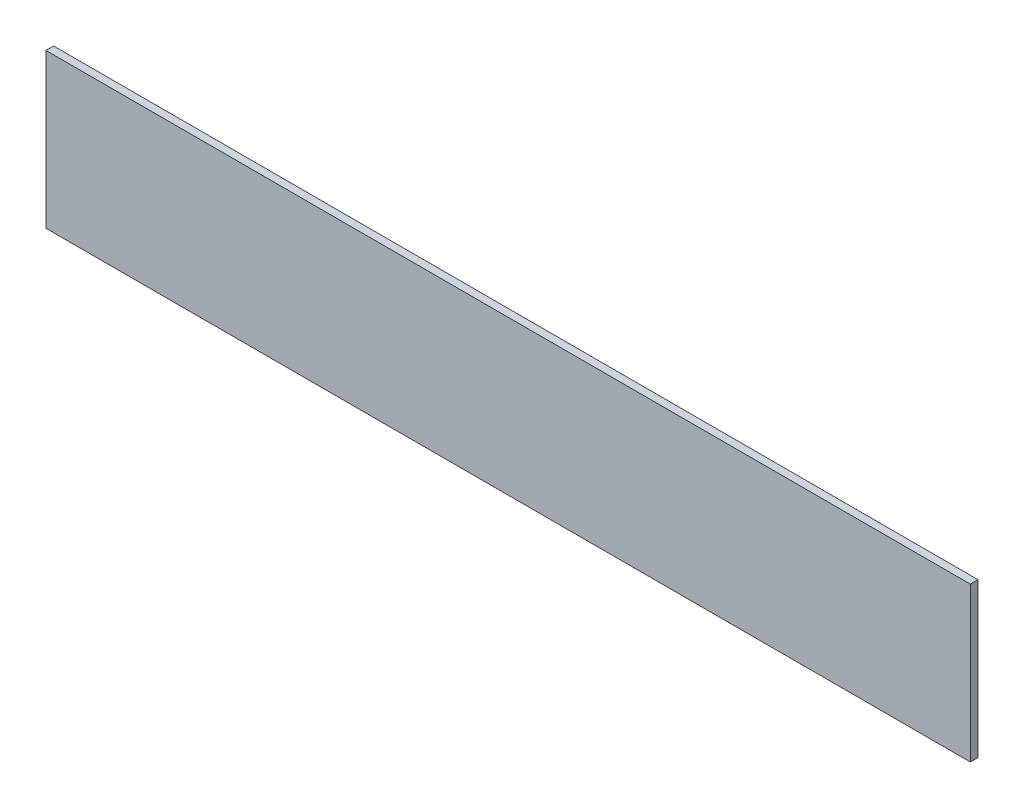
ISO-10303-21;
HEADER;
FILE_DESCRIPTION(('STEP AP214'),'2;1');
FILE_NAME('part.step','',(''),(''),'','','');
FILE_SCHEMA(('AUTOMOTIVE_DESIGN { 1 0 10303 214 1 1 1 1 }'));
ENDSEC;
DATA;
#1=APPLICATION_CONTEXT('core data for automotive mechanical design processes');
#2=APPLICATION_PROTOCOL_DEFINITION('international standard','automotive_design',2000,#1);
#3=PRODUCT_CONTEXT('',#1,'mechanical');
#4=PRODUCT('Part','Part','',(#3));
#5=PRODUCT_RELATED_PRODUCT_CATEGORY('part','',(#4));
#6=PRODUCT_DEFINITION_FORMATION('','',#4);
#7=PRODUCT_DEFINITION_CONTEXT('part definition',#1,'design');
#8=PRODUCT_DEFINITION('design','',#6,#7);
#9=PRODUCT_DEFINITION_SHAPE('','',#8);
#10=(LENGTH_UNIT() NAMED_UNIT(*) SI_UNIT(.MILLI.,.METRE.));
#11=(NAMED_UNIT(*) PLANE_ANGLE_UNIT() SI_UNIT($,.RADIAN.));
#12=(NAMED_UNIT(*) SI_UNIT($,.STERADIAN.) SOLID_ANGLE_UNIT());
#13=UNCERTAINTY_MEASURE_WITH_UNIT(LENGTH_MEASURE(1.E-05),#10,'distance_accuracy_value','');
#14=(GEOMETRIC_REPRESENTATION_CONTEXT(3) GLOBAL_UNCERTAINTY_ASSIGNED_CONTEXT((#13)) GLOBAL_UNIT_ASSIGNED_CONTEXT((#10,
#11,#12)) REPRESENTATION_CONTEXT('',''));
#15=CARTESIAN_POINT('',(0.,0.,0.));
#16=DIRECTION('',(0.,0.,1.));
#17=DIRECTION('',(1.,0.,0.));
#18=AXIS2_PLACEMENT_3D('',#15,#16,#17);
#19=CARTESIAN_POINT('',(0.,0.,10.));
#20=DIRECTION('',(1.,0.,0.));
#21=DIRECTION('',(0.,1.,0.));
#22=AXIS2_PLACEMENT_3D('',#19,#20,#21);
#23=PLANE('',#22);
#24=DIRECTION('',(0.,-1.,0.));
#25=VECTOR('',#24,1.);
#26=CARTESIAN_POINT('',(0.,0.,0.));
#27=LINE('',#26,#25);
#28=CARTESIAN_POINT('',(0.,0.,0.));
#29=VERTEX_POINT('',#28);
#30=CARTESIAN_POINT('',(0.,-200.,0.));
#31=VERTEX_POINT('',#30);
#32=EDGE_CURVE('E96',#29,#31,#27,.T.);
#33=ORIENTED_EDGE('',*,*,#32,.T.);
#34=DIRECTION('',(0.,0.,-1.));
#35=VECTOR('',#34,1.);
#36=CARTESIAN_POINT('',(0.,-200.,10.));
#37=LINE('',#36,#35);
#38=CARTESIAN_POINT('',(0.,-200.,10.));
#39=VERTEX_POINT('',#38);
#40=EDGE_CURVE('E11',#39,#31,#37,.T.);
#41=ORIENTED_EDGE('',*,*,#40,.F.);
#42=DIRECTION('',(0.,-1.,0.));
#43=VECTOR('',#42,1.);
#44=CARTESIAN_POINT('',(0.,0.,10.));
#45=LINE('',#44,#43);
#46=CARTESIAN_POINT('',(0.,0.,10.));
#47=VERTEX_POINT('',#46);
#48=EDGE_CURVE('E84',#47,#39,#45,.T.);
#49=ORIENTED_EDGE('',*,*,#48,.F.);
#50=DIRECTION('',(0.,0.,-1.));
#51=VECTOR('',#50,1.);
#52=CARTESIAN_POINT('',(0.,0.,10.));
#53=LINE('',#52,#51);
#54=EDGE_CURVE('E92',#47,#29,#53,.T.);
#55=ORIENTED_EDGE('',*,*,#54,.T.);
#56=EDGE_LOOP('',(#33,#41,#49,#55));
#57=FACE_BOUND('',#56,.T.);
#58=ADVANCED_FACE('F33',(#57),#23,.F.);
#59=CARTESIAN_POINT('',(0.,-200.,10.));
#60=DIRECTION('',(0.,1.,0.));
#61=DIRECTION('',(0.,0.,1.));
#62=AXIS2_PLACEMENT_3D('',#59,#60,#61);
#63=PLANE('',#62);
#64=DIRECTION('',(1.,0.,0.));
#65=VECTOR('',#64,1.);
#66=CARTESIAN_POINT('',(0.,-200.,0.));
#67=LINE('',#66,#65);
#68=CARTESIAN_POINT('',(1200.,-200.,0.));
#69=VERTEX_POINT('',#68);
#70=EDGE_CURVE('E88',#31,#69,#67,.T.);
#71=ORIENTED_EDGE('',*,*,#70,.T.);
#72=DIRECTION('',(0.,0.,-1.));
#73=VECTOR('',#72,1.);
#74=CARTESIAN_POINT('',(1200.,-200.,10.));
#75=LINE('',#74,#73);
#76=CARTESIAN_POINT('',(1200.,-200.,10.));
#77=VERTEX_POINT('',#76);
#78=EDGE_CURVE('E41',#77,#69,#75,.T.);
#79=ORIENTED_EDGE('',*,*,#78,.F.);
#80=DIRECTION('',(1.,0.,0.));
#81=VECTOR('',#80,1.);
#82=CARTESIAN_POINT('',(0.,-200.,10.));
#83=LINE('',#82,#81);
#84=EDGE_CURVE('E79',#39,#77,#83,.T.);
#85=ORIENTED_EDGE('',*,*,#84,.F.);
#86=ORIENTED_EDGE('',*,*,#40,.T.);
#87=EDGE_LOOP('',(#71,#79,#85,#86));
#88=FACE_BOUND('',#87,.T.);
#89=ADVANCED_FACE('F87',(#88),#63,.F.);
#90=CARTESIAN_POINT('',(1200.,0.,10.));
#91=DIRECTION('',(-1.,0.,0.));
#92=DIRECTION('',(0.,0.,1.));
#93=AXIS2_PLACEMENT_3D('',#90,#91,#92);
#94=PLANE('',#93);
#95=DIRECTION('',(0.,1.,0.));
#96=VECTOR('',#95,1.);
#97=CARTESIAN_POINT('',(1200.,0.,0.));
#98=LINE('',#97,#96);
#99=CARTESIAN_POINT('',(1200.,0.,0.));
#100=VERTEX_POINT('',#99);
#101=EDGE_CURVE('E66',#69,#100,#98,.T.);
#102=ORIENTED_EDGE('',*,*,#101,.T.);
#103=DIRECTION('',(0.,0.,-1.));
#104=VECTOR('',#103,1.);
#105=CARTESIAN_POINT('',(1200.,0.,10.));
#106=LINE('',#105,#104);
#107=CARTESIAN_POINT('',(1200.,0.,10.));
#108=VERTEX_POINT('',#107);
#109=EDGE_CURVE('E89',#108,#100,#106,.T.);
#110=ORIENTED_EDGE('',*,*,#109,.F.);
#111=DIRECTION('',(0.,1.,0.));
#112=VECTOR('',#111,1.);
#113=CARTESIAN_POINT('',(1200.,0.,10.));
#114=LINE('',#113,#112);
#115=EDGE_CURVE('E82',#77,#108,#114,.T.);
#116=ORIENTED_EDGE('',*,*,#115,.F.);
#117=ORIENTED_EDGE('',*,*,#78,.T.);
#118=EDGE_LOOP('',(#102,#110,#116,#117));
#119=FACE_BOUND('',#118,.T.);
#120=ADVANCED_FACE('F90',(#119),#94,.F.);
#121=CARTESIAN_POINT('',(0.,0.,10.));
#122=DIRECTION('',(0.,-1.,0.));
#123=DIRECTION('',(0.,0.,-1.));
#124=AXIS2_PLACEMENT_3D('',#121,#122,#123);
#125=PLANE('',#124);
#126=DIRECTION('',(-1.,0.,0.));
#127=VECTOR('',#126,1.);
#128=CARTESIAN_POINT('',(0.,0.,0.));
#129=LINE('',#128,#127);
#130=EDGE_CURVE('E72',#100,#29,#129,.T.);
#131=ORIENTED_EDGE('',*,*,#130,.T.);
#132=ORIENTED_EDGE('',*,*,#54,.F.);
#133=DIRECTION('',(-1.,0.,0.));
#134=VECTOR('',#133,1.);
#135=CARTESIAN_POINT('',(0.,0.,10.));
#136=LINE('',#135,#134);
#137=EDGE_CURVE('E49',#108,#47,#136,.T.);
#138=ORIENTED_EDGE('',*,*,#137,.F.);
#139=ORIENTED_EDGE('',*,*,#109,.T.);
#140=EDGE_LOOP('',(#131,#132,#138,#139));
#141=FACE_BOUND('',#140,.T.);
#142=ADVANCED_FACE('F103',(#141),#125,.F.);
#143=CARTESIAN_POINT('',(0.,0.,10.));
#144=DIRECTION('',(0.,0.,1.));
#145=DIRECTION('',(1.,0.,0.));
#146=AXIS2_PLACEMENT_3D('',#143,#144,#145);
#147=PLANE('',#146);
#148=ORIENTED_EDGE('',*,*,#48,.T.);
#149=ORIENTED_EDGE('',*,*,#84,.T.);
#150=ORIENTED_EDGE('',*,*,#115,.T.);
#151=ORIENTED_EDGE('',*,*,#137,.T.);
#152=EDGE_LOOP('',(#148,#149,#150,#151));
#153=FACE_BOUND('',#152,.T.);
#154=ADVANCED_FACE('F80',(#153),#147,.T.);
#155=CARTESIAN_POINT('',(0.,0.,0.));
#156=DIRECTION('',(0.,0.,1.));
#157=DIRECTION('',(1.,0.,0.));
#158=AXIS2_PLACEMENT_3D('',#155,#156,#157);
#159=PLANE('',#158);
#160=ORIENTED_EDGE('',*,*,#32,.F.);
#161=ORIENTED_EDGE('',*,*,#130,.F.);
#162=ORIENTED_EDGE('',*,*,#101,.F.);
#163=ORIENTED_EDGE('',*,*,#70,.F.);
#164=EDGE_LOOP('',(#160,#161,#162,#163));
#165=FACE_BOUND('',#164,.T.);
#166=ADVANCED_FACE('F106',(#165),#159,.F.);
#167=CLOSED_SHELL('',(#58,#89,#120,#142,#154,#166));
#168=MANIFOLD_SOLID_BREP('B2',#167);
#169=ADVANCED_BREP_SHAPE_REPRESENTATION('',(#18,#168),#14);
#170=SHAPE_DEFINITION_REPRESENTATION(#9,#169);
ENDSEC;
END-ISO-10303-21;
